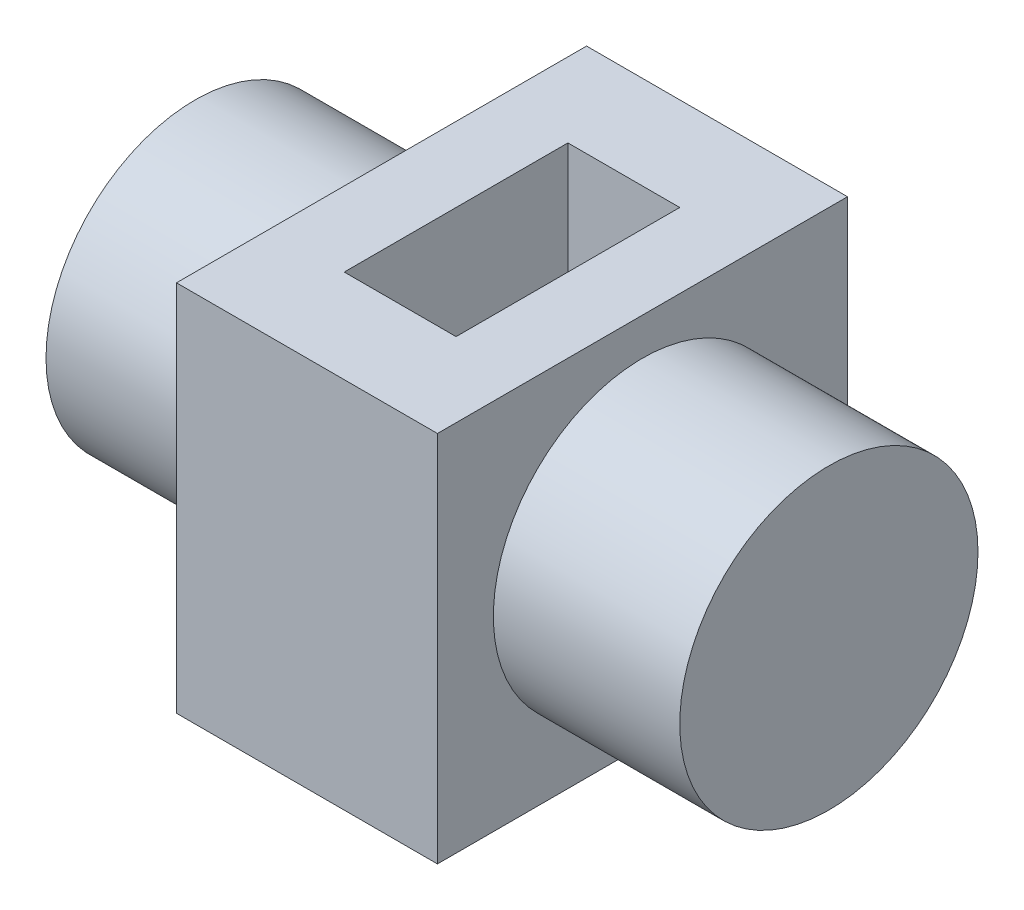
ISO-10303-21;
HEADER;
FILE_DESCRIPTION(('STEP AP214'),'2;1');
FILE_NAME('part.step','',(''),(''),'','','');
FILE_SCHEMA(('AUTOMOTIVE_DESIGN { 1 0 10303 214 1 1 1 1 }'));
ENDSEC;
DATA;
#1=APPLICATION_CONTEXT('core data for automotive mechanical design processes');
#2=APPLICATION_PROTOCOL_DEFINITION('international standard','automotive_design',2000,#1);
#3=PRODUCT_CONTEXT('',#1,'mechanical');
#4=PRODUCT('Part','Part','',(#3));
#5=PRODUCT_RELATED_PRODUCT_CATEGORY('part','',(#4));
#6=PRODUCT_DEFINITION_FORMATION('','',#4);
#7=PRODUCT_DEFINITION_CONTEXT('part definition',#1,'design');
#8=PRODUCT_DEFINITION('design','',#6,#7);
#9=PRODUCT_DEFINITION_SHAPE('','',#8);
#10=(LENGTH_UNIT() NAMED_UNIT(*) SI_UNIT(.MILLI.,.METRE.));
#11=(NAMED_UNIT(*) PLANE_ANGLE_UNIT() SI_UNIT($,.RADIAN.));
#12=(NAMED_UNIT(*) SI_UNIT($,.STERADIAN.) SOLID_ANGLE_UNIT());
#13=UNCERTAINTY_MEASURE_WITH_UNIT(LENGTH_MEASURE(1.E-05),#10,'distance_accuracy_value','');
#14=(GEOMETRIC_REPRESENTATION_CONTEXT(3) GLOBAL_UNCERTAINTY_ASSIGNED_CONTEXT((#13)) GLOBAL_UNIT_ASSIGNED_CONTEXT((#10,
#11,#12)) REPRESENTATION_CONTEXT('',''));
#15=CARTESIAN_POINT('',(0.,0.,0.));
#16=DIRECTION('',(0.,0.,1.));
#17=DIRECTION('',(1.,0.,0.));
#18=AXIS2_PLACEMENT_3D('',#15,#16,#17);
#19=CARTESIAN_POINT('',(4.88749999818643,-24.9843937109862,2.875));
#20=DIRECTION('',(0.,1.,0.));
#21=DIRECTION('',(0.,0.,1.));
#22=AXIS2_PLACEMENT_3D('',#19,#20,#21);
#23=PLANE('',#22);
#24=DIRECTION('',(0.,0.,1.));
#25=VECTOR('',#24,1.);
#26=CARTESIAN_POINT('',(7.86249999684597,-24.9843937109862,3.725));
#27=LINE('',#26,#25);
#28=CARTESIAN_POINT('',(7.86249999684597,-24.9843937109862,3.725));
#29=VERTEX_POINT('',#28);
#30=CARTESIAN_POINT('',(7.86249999684597,-24.9843937109862,6.275));
#31=VERTEX_POINT('',#30);
#32=EDGE_CURVE('E49',#29,#31,#27,.T.);
#33=ORIENTED_EDGE('',*,*,#32,.F.);
#34=DIRECTION('',(-1.,0.,0.));
#35=VECTOR('',#34,1.);
#36=CARTESIAN_POINT('',(7.86249999684597,-24.9843937109862,3.725));
#37=LINE('',#36,#35);
#38=CARTESIAN_POINT('',(9.13749999684597,-24.9843937109862,3.725));
#39=VERTEX_POINT('',#38);
#40=EDGE_CURVE('E130',#39,#29,#37,.T.);
#41=ORIENTED_EDGE('',*,*,#40,.F.);
#42=DIRECTION('',(0.,0.,-1.));
#43=VECTOR('',#42,1.);
#44=CARTESIAN_POINT('',(9.13749999684597,-24.9843937109862,3.725));
#45=LINE('',#44,#43);
#46=CARTESIAN_POINT('',(9.13749999684597,-24.9843937109862,6.275));
#47=VERTEX_POINT('',#46);
#48=EDGE_CURVE('E133',#47,#39,#45,.T.);
#49=ORIENTED_EDGE('',*,*,#48,.F.);
#50=DIRECTION('',(1.,0.,0.));
#51=VECTOR('',#50,1.);
#52=CARTESIAN_POINT('',(7.86249999684597,-24.9843937109862,6.275));
#53=LINE('',#52,#51);
#54=EDGE_CURVE('E139',#31,#47,#53,.T.);
#55=ORIENTED_EDGE('',*,*,#54,.F.);
#56=EDGE_LOOP('',(#33,#41,#49,#55));
#57=FACE_BOUND('',#56,.T.);
#58=DIRECTION('',(0.,0.,1.));
#59=VECTOR('',#58,1.);
#60=CARTESIAN_POINT('',(7.01249999818643,-24.9843937109862,7.3375));
#61=LINE('',#60,#59);
#62=CARTESIAN_POINT('',(7.01249999818643,-24.9843937109862,2.6625));
#63=VERTEX_POINT('',#62);
#64=CARTESIAN_POINT('',(7.01249999818643,-24.9843937109862,7.3375));
#65=VERTEX_POINT('',#64);
#66=EDGE_CURVE('E162',#63,#65,#61,.T.);
#67=ORIENTED_EDGE('',*,*,#66,.T.);
#68=DIRECTION('',(1.,0.,0.));
#69=VECTOR('',#68,1.);
#70=CARTESIAN_POINT('',(7.01249999818643,-24.9843937109862,7.3375));
#71=LINE('',#70,#69);
#72=CARTESIAN_POINT('',(9.98749999550551,-24.9843937109862,7.3375));
#73=VERTEX_POINT('',#72);
#74=EDGE_CURVE('E78',#65,#73,#71,.T.);
#75=ORIENTED_EDGE('',*,*,#74,.T.);
#76=DIRECTION('',(0.,0.,-1.));
#77=VECTOR('',#76,1.);
#78=CARTESIAN_POINT('',(9.98749999550551,-24.9843937109862,7.3375));
#79=LINE('',#78,#77);
#80=CARTESIAN_POINT('',(9.98749999550551,-24.9843937109862,2.6625));
#81=VERTEX_POINT('',#80);
#82=EDGE_CURVE('E169',#73,#81,#79,.T.);
#83=ORIENTED_EDGE('',*,*,#82,.T.);
#84=DIRECTION('',(-1.,0.,0.));
#85=VECTOR('',#84,1.);
#86=CARTESIAN_POINT('',(7.01249999818643,-24.9843937109862,2.6625));
#87=LINE('',#86,#85);
#88=EDGE_CURVE('E159',#81,#63,#87,.T.);
#89=ORIENTED_EDGE('',*,*,#88,.T.);
#90=EDGE_LOOP('',(#67,#75,#83,#89));
#91=FACE_BOUND('',#90,.T.);
#92=ADVANCED_FACE('F35',(#57,#91),#23,.T.);
#93=CARTESIAN_POINT('',(4.88749999818643,-27.1093937109862,5.));
#94=DIRECTION('',(-1.,0.,0.));
#95=DIRECTION('',(0.,0.,1.));
#96=AXIS2_PLACEMENT_3D('',#93,#94,#95);
#97=PLANE('',#96);
#98=CARTESIAN_POINT('',(4.88749999818643,-27.1093937109862,5.));
#99=DIRECTION('',(-1.,0.,0.));
#100=DIRECTION('',(0.,0.,1.));
#101=AXIS2_PLACEMENT_3D('',#98,#99,#100);
#102=CIRCLE('',#101,1.7);
#103=CARTESIAN_POINT('',(4.88749999818643,-27.1093937109862,6.7));
#104=VERTEX_POINT('',#103);
#105=EDGE_CURVE('E11',#104,#104,#102,.T.);
#106=ORIENTED_EDGE('',*,*,#105,.T.);
#107=EDGE_LOOP('',(#106));
#108=FACE_BOUND('',#107,.T.);
#109=ADVANCED_FACE('F209',(#108),#97,.T.);
#110=CARTESIAN_POINT('',(12.1124999955055,-27.1093937109862,5.));
#111=DIRECTION('',(1.,0.,0.));
#112=DIRECTION('',(0.,0.,-1.));
#113=AXIS2_PLACEMENT_3D('',#110,#111,#112);
#114=PLANE('',#113);
#115=CARTESIAN_POINT('',(12.1124999955055,-27.1093937109862,5.));
#116=DIRECTION('',(1.,0.,0.));
#117=DIRECTION('',(0.,0.,-1.));
#118=AXIS2_PLACEMENT_3D('',#115,#116,#117);
#119=CIRCLE('',#118,1.7);
#120=CARTESIAN_POINT('',(12.1124999955055,-27.1093937109862,3.3));
#121=VERTEX_POINT('',#120);
#122=EDGE_CURVE('E42',#121,#121,#119,.T.);
#123=ORIENTED_EDGE('',*,*,#122,.T.);
#124=EDGE_LOOP('',(#123));
#125=FACE_BOUND('',#124,.T.);
#126=ADVANCED_FACE('F205',(#125),#114,.T.);
#127=CARTESIAN_POINT('',(4.88749999818643,-27.1093937109862,5.));
#128=DIRECTION('',(1.,0.,0.));
#129=DIRECTION('',(0.,0.,-1.));
#130=AXIS2_PLACEMENT_3D('',#127,#128,#129);
#131=CYLINDRICAL_SURFACE('',#130,1.7);
#132=ORIENTED_EDGE('',*,*,#105,.F.);
#133=EDGE_LOOP('',(#132));
#134=FACE_BOUND('',#133,.T.);
#135=CARTESIAN_POINT('',(7.01249999818643,-27.1093937109862,5.));
#136=DIRECTION('',(-1.,0.,0.));
#137=DIRECTION('',(0.,0.,1.));
#138=AXIS2_PLACEMENT_3D('',#135,#136,#137);
#139=CIRCLE('',#138,1.7);
#140=CARTESIAN_POINT('',(7.01249999818643,-27.1093937109862,6.7));
#141=VERTEX_POINT('',#140);
#142=EDGE_CURVE('E145',#141,#141,#139,.T.);
#143=ORIENTED_EDGE('',*,*,#142,.T.);
#144=EDGE_LOOP('',(#143));
#145=FACE_BOUND('',#144,.T.);
#146=ADVANCED_FACE('F179',(#134,#145),#131,.T.);
#147=CARTESIAN_POINT('',(7.01249999818643,-24.9843937109862,7.3375));
#148=DIRECTION('',(0.,0.,-1.));
#149=DIRECTION('',(-1.,0.,0.));
#150=AXIS2_PLACEMENT_3D('',#147,#148,#149);
#151=PLANE('',#150);
#152=DIRECTION('',(1.,0.,0.));
#153=VECTOR('',#152,1.);
#154=CARTESIAN_POINT('',(7.01249999818643,-29.2343937109862,7.3375));
#155=LINE('',#154,#153);
#156=CARTESIAN_POINT('',(7.01249999818643,-29.2343937109862,7.3375));
#157=VERTEX_POINT('',#156);
#158=CARTESIAN_POINT('',(9.98749999550551,-29.2343937109862,7.3375));
#159=VERTEX_POINT('',#158);
#160=EDGE_CURVE('E58',#157,#159,#155,.T.);
#161=ORIENTED_EDGE('',*,*,#160,.T.);
#162=DIRECTION('',(0.,-1.,0.));
#163=VECTOR('',#162,1.);
#164=CARTESIAN_POINT('',(9.98749999550551,-24.9843937109862,7.3375));
#165=LINE('',#164,#163);
#166=EDGE_CURVE('E151',#73,#159,#165,.T.);
#167=ORIENTED_EDGE('',*,*,#166,.F.);
#168=ORIENTED_EDGE('',*,*,#74,.F.);
#169=DIRECTION('',(0.,-1.,0.));
#170=VECTOR('',#169,1.);
#171=CARTESIAN_POINT('',(7.01249999818643,-24.9843937109862,7.3375));
#172=LINE('',#171,#170);
#173=EDGE_CURVE('E149',#65,#157,#172,.T.);
#174=ORIENTED_EDGE('',*,*,#173,.T.);
#175=EDGE_LOOP('',(#161,#167,#168,#174));
#176=FACE_BOUND('',#175,.T.);
#177=ADVANCED_FACE('F195',(#176),#151,.F.);
#178=CARTESIAN_POINT('',(12.1124999955055,-27.1093937109862,5.));
#179=DIRECTION('',(-1.,0.,0.));
#180=DIRECTION('',(0.,0.,1.));
#181=AXIS2_PLACEMENT_3D('',#178,#179,#180);
#182=CYLINDRICAL_SURFACE('',#181,1.7);
#183=ORIENTED_EDGE('',*,*,#122,.F.);
#184=EDGE_LOOP('',(#183));
#185=FACE_BOUND('',#184,.T.);
#186=CARTESIAN_POINT('',(9.98749999550551,-27.1093937109862,5.));
#187=DIRECTION('',(1.,0.,0.));
#188=DIRECTION('',(0.,0.,-1.));
#189=AXIS2_PLACEMENT_3D('',#186,#187,#188);
#190=CIRCLE('',#189,1.7);
#191=CARTESIAN_POINT('',(9.98749999550551,-27.1093937109862,3.3));
#192=VERTEX_POINT('',#191);
#193=EDGE_CURVE('E152',#192,#192,#190,.T.);
#194=ORIENTED_EDGE('',*,*,#193,.T.);
#195=EDGE_LOOP('',(#194));
#196=FACE_BOUND('',#195,.T.);
#197=ADVANCED_FACE('F197',(#185,#196),#182,.T.);
#198=CARTESIAN_POINT('',(9.98749999550551,-24.9843937109862,7.3375));
#199=DIRECTION('',(-1.,0.,0.));
#200=DIRECTION('',(0.,0.,1.));
#201=AXIS2_PLACEMENT_3D('',#198,#199,#200);
#202=PLANE('',#201);
#203=ORIENTED_EDGE('',*,*,#193,.F.);
#204=EDGE_LOOP('',(#203));
#205=FACE_BOUND('',#204,.T.);
#206=DIRECTION('',(0.,0.,-1.));
#207=VECTOR('',#206,1.);
#208=CARTESIAN_POINT('',(9.98749999550551,-29.2343937109862,7.3375));
#209=LINE('',#208,#207);
#210=CARTESIAN_POINT('',(9.98749999550551,-29.2343937109862,2.6625));
#211=VERTEX_POINT('',#210);
#212=EDGE_CURVE('E161',#159,#211,#209,.T.);
#213=ORIENTED_EDGE('',*,*,#212,.T.);
#214=DIRECTION('',(0.,-1.,0.));
#215=VECTOR('',#214,1.);
#216=CARTESIAN_POINT('',(9.98749999550551,-24.9843937109862,2.6625));
#217=LINE('',#216,#215);
#218=EDGE_CURVE('E155',#81,#211,#217,.T.);
#219=ORIENTED_EDGE('',*,*,#218,.F.);
#220=ORIENTED_EDGE('',*,*,#82,.F.);
#221=ORIENTED_EDGE('',*,*,#166,.T.);
#222=EDGE_LOOP('',(#213,#219,#220,#221));
#223=FACE_BOUND('',#222,.T.);
#224=ADVANCED_FACE('F185',(#205,#223),#202,.F.);
#225=CARTESIAN_POINT('',(7.01249999818643,-24.9843937109862,7.3375));
#226=DIRECTION('',(1.,0.,0.));
#227=DIRECTION('',(0.,0.,-1.));
#228=AXIS2_PLACEMENT_3D('',#225,#226,#227);
#229=PLANE('',#228);
#230=ORIENTED_EDGE('',*,*,#142,.F.);
#231=EDGE_LOOP('',(#230));
#232=FACE_BOUND('',#231,.T.);
#233=DIRECTION('',(0.,0.,1.));
#234=VECTOR('',#233,1.);
#235=CARTESIAN_POINT('',(7.01249999818643,-29.2343937109862,7.3375));
#236=LINE('',#235,#234);
#237=CARTESIAN_POINT('',(7.01249999818643,-29.2343937109862,2.6625));
#238=VERTEX_POINT('',#237);
#239=EDGE_CURVE('E165',#238,#157,#236,.T.);
#240=ORIENTED_EDGE('',*,*,#239,.T.);
#241=ORIENTED_EDGE('',*,*,#173,.F.);
#242=ORIENTED_EDGE('',*,*,#66,.F.);
#243=DIRECTION('',(0.,-1.,0.));
#244=VECTOR('',#243,1.);
#245=CARTESIAN_POINT('',(7.01249999818643,-24.9843937109862,2.6625));
#246=LINE('',#245,#244);
#247=EDGE_CURVE('E157',#63,#238,#246,.T.);
#248=ORIENTED_EDGE('',*,*,#247,.T.);
#249=EDGE_LOOP('',(#240,#241,#242,#248));
#250=FACE_BOUND('',#249,.T.);
#251=ADVANCED_FACE('F181',(#232,#250),#229,.F.);
#252=CARTESIAN_POINT('',(4.88749999818643,-29.2343937109862,2.875));
#253=DIRECTION('',(0.,1.,0.));
#254=DIRECTION('',(0.,0.,1.));
#255=AXIS2_PLACEMENT_3D('',#252,#253,#254);
#256=PLANE('',#255);
#257=ORIENTED_EDGE('',*,*,#239,.F.);
#258=DIRECTION('',(-1.,0.,0.));
#259=VECTOR('',#258,1.);
#260=CARTESIAN_POINT('',(7.01249999818643,-29.2343937109862,2.6625));
#261=LINE('',#260,#259);
#262=EDGE_CURVE('E86',#211,#238,#261,.T.);
#263=ORIENTED_EDGE('',*,*,#262,.F.);
#264=ORIENTED_EDGE('',*,*,#212,.F.);
#265=ORIENTED_EDGE('',*,*,#160,.F.);
#266=EDGE_LOOP('',(#257,#263,#264,#265));
#267=FACE_BOUND('',#266,.T.);
#268=ADVANCED_FACE('F184',(#267),#256,.F.);
#269=CARTESIAN_POINT('',(7.01249999818643,-24.9843937109862,2.6625));
#270=DIRECTION('',(0.,0.,1.));
#271=DIRECTION('',(1.,0.,0.));
#272=AXIS2_PLACEMENT_3D('',#269,#270,#271);
#273=PLANE('',#272);
#274=ORIENTED_EDGE('',*,*,#262,.T.);
#275=ORIENTED_EDGE('',*,*,#247,.F.);
#276=ORIENTED_EDGE('',*,*,#88,.F.);
#277=ORIENTED_EDGE('',*,*,#218,.T.);
#278=EDGE_LOOP('',(#274,#275,#276,#277));
#279=FACE_BOUND('',#278,.T.);
#280=ADVANCED_FACE('F193',(#279),#273,.F.);
#281=CARTESIAN_POINT('',(7.86249999684597,-27.1093937109862,3.725));
#282=DIRECTION('',(-1.,0.,0.));
#283=DIRECTION('',(0.,0.,1.));
#284=AXIS2_PLACEMENT_3D('',#281,#282,#283);
#285=PLANE('',#284);
#286=ORIENTED_EDGE('',*,*,#32,.T.);
#287=DIRECTION('',(0.,1.,0.));
#288=VECTOR('',#287,1.);
#289=CARTESIAN_POINT('',(7.86249999684597,-27.1093937109862,6.275));
#290=LINE('',#289,#288);
#291=CARTESIAN_POINT('',(7.86249999684597,-27.1093937109862,6.275));
#292=VERTEX_POINT('',#291);
#293=EDGE_CURVE('E108',#292,#31,#290,.T.);
#294=ORIENTED_EDGE('',*,*,#293,.F.);
#295=DIRECTION('',(0.,0.,1.));
#296=VECTOR('',#295,1.);
#297=CARTESIAN_POINT('',(7.86249999684597,-27.1093937109862,3.725));
#298=LINE('',#297,#296);
#299=CARTESIAN_POINT('',(7.86249999684597,-27.1093937109862,3.725));
#300=VERTEX_POINT('',#299);
#301=EDGE_CURVE('E112',#300,#292,#298,.T.);
#302=ORIENTED_EDGE('',*,*,#301,.F.);
#303=DIRECTION('',(0.,1.,0.));
#304=VECTOR('',#303,1.);
#305=CARTESIAN_POINT('',(7.86249999684597,-27.1093937109862,3.725));
#306=LINE('',#305,#304);
#307=EDGE_CURVE('E143',#300,#29,#306,.T.);
#308=ORIENTED_EDGE('',*,*,#307,.T.);
#309=EDGE_LOOP('',(#286,#294,#302,#308));
#310=FACE_BOUND('',#309,.T.);
#311=ADVANCED_FACE('F110',(#310),#285,.F.);
#312=CARTESIAN_POINT('',(7.86249999684597,-27.1093937109862,3.725));
#313=DIRECTION('',(0.,0.,-1.));
#314=DIRECTION('',(-1.,0.,0.));
#315=AXIS2_PLACEMENT_3D('',#312,#313,#314);
#316=PLANE('',#315);
#317=ORIENTED_EDGE('',*,*,#40,.T.);
#318=ORIENTED_EDGE('',*,*,#307,.F.);
#319=DIRECTION('',(-1.,0.,0.));
#320=VECTOR('',#319,1.);
#321=CARTESIAN_POINT('',(7.86249999684597,-27.1093937109862,3.725));
#322=LINE('',#321,#320);
#323=CARTESIAN_POINT('',(9.13749999684597,-27.1093937109862,3.725));
#324=VERTEX_POINT('',#323);
#325=EDGE_CURVE('E118',#324,#300,#322,.T.);
#326=ORIENTED_EDGE('',*,*,#325,.F.);
#327=DIRECTION('',(0.,1.,0.));
#328=VECTOR('',#327,1.);
#329=CARTESIAN_POINT('',(9.13749999684597,-27.1093937109862,3.725));
#330=LINE('',#329,#328);
#331=EDGE_CURVE('E146',#324,#39,#330,.T.);
#332=ORIENTED_EDGE('',*,*,#331,.T.);
#333=EDGE_LOOP('',(#317,#318,#326,#332));
#334=FACE_BOUND('',#333,.T.);
#335=ADVANCED_FACE('F249',(#334),#316,.F.);
#336=CARTESIAN_POINT('',(9.13749999684597,-27.1093937109862,3.725));
#337=DIRECTION('',(1.,0.,0.));
#338=DIRECTION('',(0.,0.,-1.));
#339=AXIS2_PLACEMENT_3D('',#336,#337,#338);
#340=PLANE('',#339);
#341=ORIENTED_EDGE('',*,*,#48,.T.);
#342=ORIENTED_EDGE('',*,*,#331,.F.);
#343=DIRECTION('',(0.,0.,-1.));
#344=VECTOR('',#343,1.);
#345=CARTESIAN_POINT('',(9.13749999684597,-27.1093937109862,3.725));
#346=LINE('',#345,#344);
#347=CARTESIAN_POINT('',(9.13749999684597,-27.1093937109862,6.275));
#348=VERTEX_POINT('',#347);
#349=EDGE_CURVE('E126',#348,#324,#346,.T.);
#350=ORIENTED_EDGE('',*,*,#349,.F.);
#351=DIRECTION('',(0.,1.,0.));
#352=VECTOR('',#351,1.);
#353=CARTESIAN_POINT('',(9.13749999684597,-27.1093937109862,6.275));
#354=LINE('',#353,#352);
#355=EDGE_CURVE('E117',#348,#47,#354,.T.);
#356=ORIENTED_EDGE('',*,*,#355,.T.);
#357=EDGE_LOOP('',(#341,#342,#350,#356));
#358=FACE_BOUND('',#357,.T.);
#359=ADVANCED_FACE('F256',(#358),#340,.F.);
#360=CARTESIAN_POINT('',(7.86249999684597,-27.1093937109862,6.275));
#361=DIRECTION('',(0.,0.,1.));
#362=DIRECTION('',(1.,0.,0.));
#363=AXIS2_PLACEMENT_3D('',#360,#361,#362);
#364=PLANE('',#363);
#365=ORIENTED_EDGE('',*,*,#54,.T.);
#366=ORIENTED_EDGE('',*,*,#355,.F.);
#367=DIRECTION('',(1.,0.,0.));
#368=VECTOR('',#367,1.);
#369=CARTESIAN_POINT('',(7.86249999684597,-27.1093937109862,6.275));
#370=LINE('',#369,#368);
#371=EDGE_CURVE('E121',#292,#348,#370,.T.);
#372=ORIENTED_EDGE('',*,*,#371,.F.);
#373=ORIENTED_EDGE('',*,*,#293,.T.);
#374=EDGE_LOOP('',(#365,#366,#372,#373));
#375=FACE_BOUND('',#374,.T.);
#376=ADVANCED_FACE('F122',(#375),#364,.F.);
#377=CARTESIAN_POINT('',(4.88749999818643,-27.1093937109862,2.875));
#378=DIRECTION('',(0.,1.,0.));
#379=DIRECTION('',(0.,0.,1.));
#380=AXIS2_PLACEMENT_3D('',#377,#378,#379);
#381=PLANE('',#380);
#382=ORIENTED_EDGE('',*,*,#301,.T.);
#383=ORIENTED_EDGE('',*,*,#371,.T.);
#384=ORIENTED_EDGE('',*,*,#349,.T.);
#385=ORIENTED_EDGE('',*,*,#325,.T.);
#386=EDGE_LOOP('',(#382,#383,#384,#385));
#387=FACE_BOUND('',#386,.T.);
#388=ADVANCED_FACE('F128',(#387),#381,.T.);
#389=CLOSED_SHELL('',(#92,#109,#126,#146,#177,#197,#224,#251,#268,#280,#311,#335,#359,#376,#388));
#390=MANIFOLD_SOLID_BREP('B2',#389);
#391=ADVANCED_BREP_SHAPE_REPRESENTATION('',(#18,#390),#14);
#392=SHAPE_DEFINITION_REPRESENTATION(#9,#391);
ENDSEC;
END-ISO-10303-21;
